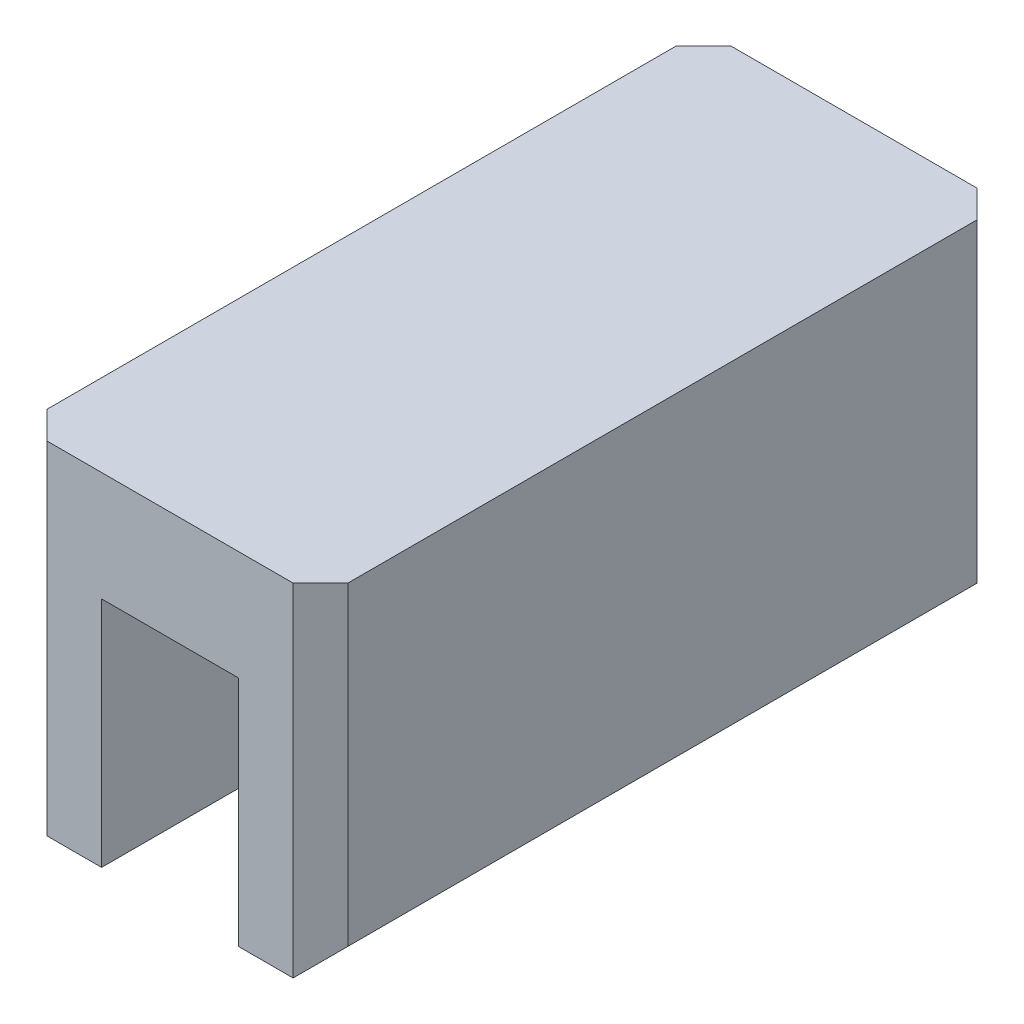
ISO-10303-21;
HEADER;
FILE_DESCRIPTION(('STEP AP214'),'2;1');
FILE_NAME('part.step','',(''),(''),'','','');
FILE_SCHEMA(('AUTOMOTIVE_DESIGN { 1 0 10303 214 1 1 1 1 }'));
ENDSEC;
DATA;
#1=APPLICATION_CONTEXT('core data for automotive mechanical design processes');
#2=APPLICATION_PROTOCOL_DEFINITION('international standard','automotive_design',2000,#1);
#3=PRODUCT_CONTEXT('',#1,'mechanical');
#4=PRODUCT('Part','Part','',(#3));
#5=PRODUCT_RELATED_PRODUCT_CATEGORY('part','',(#4));
#6=PRODUCT_DEFINITION_FORMATION('','',#4);
#7=PRODUCT_DEFINITION_CONTEXT('part definition',#1,'design');
#8=PRODUCT_DEFINITION('design','',#6,#7);
#9=PRODUCT_DEFINITION_SHAPE('','',#8);
#10=(LENGTH_UNIT() NAMED_UNIT(*) SI_UNIT(.MILLI.,.METRE.));
#11=(NAMED_UNIT(*) PLANE_ANGLE_UNIT() SI_UNIT($,.RADIAN.));
#12=(NAMED_UNIT(*) SI_UNIT($,.STERADIAN.) SOLID_ANGLE_UNIT());
#13=UNCERTAINTY_MEASURE_WITH_UNIT(LENGTH_MEASURE(1.E-05),#10,'distance_accuracy_value','');
#14=(GEOMETRIC_REPRESENTATION_CONTEXT(3) GLOBAL_UNCERTAINTY_ASSIGNED_CONTEXT((#13)) GLOBAL_UNIT_ASSIGNED_CONTEXT((#10,
#11,#12)) REPRESENTATION_CONTEXT('',''));
#15=CARTESIAN_POINT('',(0.,0.,0.));
#16=DIRECTION('',(0.,0.,1.));
#17=DIRECTION('',(1.,0.,0.));
#18=AXIS2_PLACEMENT_3D('',#15,#16,#17);
#19=CARTESIAN_POINT('',(5.,-17.,50.));
#20=DIRECTION('',(1.,0.,0.));
#21=DIRECTION('',(0.,1.,0.));
#22=AXIS2_PLACEMENT_3D('',#19,#20,#21);
#23=PLANE('',#22);
#24=DIRECTION('',(0.,-1.,0.));
#25=VECTOR('',#24,1.);
#26=CARTESIAN_POINT('',(5.,-17.,0.));
#27=LINE('',#26,#25);
#28=CARTESIAN_POINT('',(5.,0.,0.));
#29=VERTEX_POINT('',#28);
#30=CARTESIAN_POINT('',(5.,-17.,0.));
#31=VERTEX_POINT('',#30);
#32=EDGE_CURVE('E155',#29,#31,#27,.T.);
#33=ORIENTED_EDGE('',*,*,#32,.T.);
#34=DIRECTION('',(0.,0.,-1.));
#35=VECTOR('',#34,1.);
#36=CARTESIAN_POINT('',(5.,-17.,50.));
#37=LINE('',#36,#35);
#38=CARTESIAN_POINT('',(5.,-17.,50.));
#39=VERTEX_POINT('',#38);
#40=EDGE_CURVE('E136',#39,#31,#37,.T.);
#41=ORIENTED_EDGE('',*,*,#40,.F.);
#42=DIRECTION('',(0.,-1.,0.));
#43=VECTOR('',#42,1.);
#44=CARTESIAN_POINT('',(5.,-17.,50.));
#45=LINE('',#44,#43);
#46=CARTESIAN_POINT('',(5.,0.,50.));
#47=VERTEX_POINT('',#46);
#48=EDGE_CURVE('E142',#47,#39,#45,.T.);
#49=ORIENTED_EDGE('',*,*,#48,.F.);
#50=DIRECTION('',(0.,0.,-1.));
#51=VECTOR('',#50,1.);
#52=CARTESIAN_POINT('',(5.,0.,50.));
#53=LINE('',#52,#51);
#54=EDGE_CURVE('E219',#47,#29,#53,.T.);
#55=ORIENTED_EDGE('',*,*,#54,.T.);
#56=EDGE_LOOP('',(#33,#41,#49,#55));
#57=FACE_BOUND('',#56,.T.);
#58=ADVANCED_FACE('F39',(#57),#23,.F.);
#59=CARTESIAN_POINT('',(11.,-17.,50.));
#60=DIRECTION('',(0.,1.,0.));
#61=DIRECTION('',(0.,0.,1.));
#62=AXIS2_PLACEMENT_3D('',#59,#60,#61);
#63=PLANE('',#62);
#64=DIRECTION('',(1.,0.,0.));
#65=VECTOR('',#64,1.);
#66=CARTESIAN_POINT('',(11.,-17.,0.));
#67=LINE('',#66,#65);
#68=CARTESIAN_POINT('',(9.,-17.,0.));
#69=VERTEX_POINT('',#68);
#70=EDGE_CURVE('E221',#31,#69,#67,.T.);
#71=ORIENTED_EDGE('',*,*,#70,.T.);
#72=DIRECTION('',(0.,0.,1.));
#73=VECTOR('',#72,1.);
#74=CARTESIAN_POINT('',(9.,-17.,50.));
#75=LINE('',#74,#73);
#76=CARTESIAN_POINT('',(9.,-17.,50.));
#77=VERTEX_POINT('',#76);
#78=EDGE_CURVE('E11',#69,#77,#75,.T.);
#79=ORIENTED_EDGE('',*,*,#78,.T.);
#80=DIRECTION('',(1.,0.,0.));
#81=VECTOR('',#80,1.);
#82=CARTESIAN_POINT('',(11.,-17.,50.));
#83=LINE('',#82,#81);
#84=EDGE_CURVE('E131',#39,#77,#83,.T.);
#85=ORIENTED_EDGE('',*,*,#84,.F.);
#86=ORIENTED_EDGE('',*,*,#40,.T.);
#87=EDGE_LOOP('',(#71,#79,#85,#86));
#88=FACE_BOUND('',#87,.T.);
#89=ADVANCED_FACE('F134',(#88),#63,.F.);
#90=CARTESIAN_POINT('',(11.,8.,50.));
#91=DIRECTION('',(-1.,0.,0.));
#92=DIRECTION('',(0.,-1.,0.));
#93=AXIS2_PLACEMENT_3D('',#90,#91,#92);
#94=PLANE('',#93);
#95=DIRECTION('',(0.,0.,-1.));
#96=VECTOR('',#95,1.);
#97=CARTESIAN_POINT('',(11.,-15.,50.));
#98=LINE('',#97,#96);
#99=CARTESIAN_POINT('',(11.,-15.,48.));
#100=VERTEX_POINT('',#99);
#101=CARTESIAN_POINT('',(11.,-15.,2.00000000000001));
#102=VERTEX_POINT('',#101);
#103=EDGE_CURVE('E57',#100,#102,#98,.T.);
#104=ORIENTED_EDGE('',*,*,#103,.T.);
#105=DIRECTION('',(0.,1.,0.));
#106=VECTOR('',#105,1.);
#107=CARTESIAN_POINT('',(11.,8.,2.00000000000001));
#108=LINE('',#107,#106);
#109=CARTESIAN_POINT('',(11.,8.,2.00000000000001));
#110=VERTEX_POINT('',#109);
#111=EDGE_CURVE('E49',#102,#110,#108,.T.);
#112=ORIENTED_EDGE('',*,*,#111,.T.);
#113=DIRECTION('',(0.,0.,-1.));
#114=VECTOR('',#113,1.);
#115=CARTESIAN_POINT('',(11.,8.,50.));
#116=LINE('',#115,#114);
#117=CARTESIAN_POINT('',(11.,8.,48.));
#118=VERTEX_POINT('',#117);
#119=EDGE_CURVE('E157',#118,#110,#116,.T.);
#120=ORIENTED_EDGE('',*,*,#119,.F.);
#121=DIRECTION('',(0.,-1.,0.));
#122=VECTOR('',#121,1.);
#123=CARTESIAN_POINT('',(11.,-17.,48.));
#124=LINE('',#123,#122);
#125=EDGE_CURVE('E62',#118,#100,#124,.T.);
#126=ORIENTED_EDGE('',*,*,#125,.T.);
#127=EDGE_LOOP('',(#104,#112,#120,#126));
#128=FACE_BOUND('',#127,.T.);
#129=ADVANCED_FACE('F270',(#128),#94,.F.);
#130=CARTESIAN_POINT('',(-11.,8.,50.));
#131=DIRECTION('',(0.,-1.,0.));
#132=DIRECTION('',(0.,0.,-1.));
#133=AXIS2_PLACEMENT_3D('',#130,#131,#132);
#134=PLANE('',#133);
#135=DIRECTION('',(-1.,0.,0.));
#136=VECTOR('',#135,1.);
#137=CARTESIAN_POINT('',(-11.,8.,0.));
#138=LINE('',#137,#136);
#139=CARTESIAN_POINT('',(8.99999999999999,8.,0.));
#140=VERTEX_POINT('',#139);
#141=CARTESIAN_POINT('',(-8.99999999999999,8.,0.));
#142=VERTEX_POINT('',#141);
#143=EDGE_CURVE('E223',#140,#142,#138,.T.);
#144=ORIENTED_EDGE('',*,*,#143,.T.);
#145=DIRECTION('',(0.707106781186546,0.,-0.707106781186549));
#146=VECTOR('',#145,1.);
#147=CARTESIAN_POINT('',(-11.,8.,2.00000000000001));
#148=LINE('',#147,#146);
#149=CARTESIAN_POINT('',(-11.,8.,2.00000000000001));
#150=VERTEX_POINT('',#149);
#151=EDGE_CURVE('E180',#142,#150,#148,.F.);
#152=ORIENTED_EDGE('',*,*,#151,.T.);
#153=DIRECTION('',(0.,0.,-1.));
#154=VECTOR('',#153,1.);
#155=CARTESIAN_POINT('',(-11.,8.,50.));
#156=LINE('',#155,#154);
#157=CARTESIAN_POINT('',(-11.,8.,48.));
#158=VERTEX_POINT('',#157);
#159=EDGE_CURVE('E162',#158,#150,#156,.T.);
#160=ORIENTED_EDGE('',*,*,#159,.F.);
#161=DIRECTION('',(0.707106781186546,0.,0.707106781186549));
#162=VECTOR('',#161,1.);
#163=CARTESIAN_POINT('',(-8.99999999999999,8.,50.));
#164=LINE('',#163,#162);
#165=CARTESIAN_POINT('',(-8.99999999999999,8.,50.));
#166=VERTEX_POINT('',#165);
#167=EDGE_CURVE('E178',#158,#166,#164,.T.);
#168=ORIENTED_EDGE('',*,*,#167,.T.);
#169=DIRECTION('',(-1.,0.,0.));
#170=VECTOR('',#169,1.);
#171=CARTESIAN_POINT('',(-11.,8.,50.));
#172=LINE('',#171,#170);
#173=CARTESIAN_POINT('',(8.99999999999999,8.,50.));
#174=VERTEX_POINT('',#173);
#175=EDGE_CURVE('E141',#174,#166,#172,.T.);
#176=ORIENTED_EDGE('',*,*,#175,.F.);
#177=DIRECTION('',(0.707106781186546,0.,-0.707106781186549));
#178=VECTOR('',#177,1.);
#179=CARTESIAN_POINT('',(8.99999999999999,8.,50.));
#180=LINE('',#179,#178);
#181=EDGE_CURVE('E174',#174,#118,#180,.T.);
#182=ORIENTED_EDGE('',*,*,#181,.T.);
#183=ORIENTED_EDGE('',*,*,#119,.T.);
#184=DIRECTION('',(0.707106781186546,0.,0.707106781186549));
#185=VECTOR('',#184,1.);
#186=CARTESIAN_POINT('',(11.,8.,2.00000000000001));
#187=LINE('',#186,#185);
#188=EDGE_CURVE('E176',#110,#140,#187,.F.);
#189=ORIENTED_EDGE('',*,*,#188,.T.);
#190=EDGE_LOOP('',(#144,#152,#160,#168,#176,#182,#183,#189));
#191=FACE_BOUND('',#190,.T.);
#192=ADVANCED_FACE('F209',(#191),#134,.F.);
#193=CARTESIAN_POINT('',(-11.,-17.,50.));
#194=DIRECTION('',(1.,0.,0.));
#195=DIRECTION('',(0.,1.,0.));
#196=AXIS2_PLACEMENT_3D('',#193,#194,#195);
#197=PLANE('',#196);
#198=ORIENTED_EDGE('',*,*,#159,.T.);
#199=DIRECTION('',(0.,-1.,0.));
#200=VECTOR('',#199,1.);
#201=CARTESIAN_POINT('',(-11.,-17.,2.00000000000001));
#202=LINE('',#201,#200);
#203=CARTESIAN_POINT('',(-11.,-15.,2.00000000000001));
#204=VERTEX_POINT('',#203);
#205=EDGE_CURVE('E167',#150,#204,#202,.T.);
#206=ORIENTED_EDGE('',*,*,#205,.T.);
#207=DIRECTION('',(0.,0.,1.));
#208=VECTOR('',#207,1.);
#209=CARTESIAN_POINT('',(-11.,-15.,50.));
#210=LINE('',#209,#208);
#211=CARTESIAN_POINT('',(-11.,-15.,48.));
#212=VERTEX_POINT('',#211);
#213=EDGE_CURVE('E159',#204,#212,#210,.T.);
#214=ORIENTED_EDGE('',*,*,#213,.T.);
#215=DIRECTION('',(0.,1.,0.));
#216=VECTOR('',#215,1.);
#217=CARTESIAN_POINT('',(-11.,8.,48.));
#218=LINE('',#217,#216);
#219=EDGE_CURVE('E156',#212,#158,#218,.T.);
#220=ORIENTED_EDGE('',*,*,#219,.T.);
#221=EDGE_LOOP('',(#198,#206,#214,#220));
#222=FACE_BOUND('',#221,.T.);
#223=ADVANCED_FACE('F239',(#222),#197,.F.);
#224=CARTESIAN_POINT('',(-5.,-17.,50.));
#225=DIRECTION('',(0.,1.,0.));
#226=DIRECTION('',(0.,0.,1.));
#227=AXIS2_PLACEMENT_3D('',#224,#225,#226);
#228=PLANE('',#227);
#229=DIRECTION('',(1.,0.,0.));
#230=VECTOR('',#229,1.);
#231=CARTESIAN_POINT('',(-5.,-17.,50.));
#232=LINE('',#231,#230);
#233=CARTESIAN_POINT('',(-9.,-17.,50.));
#234=VERTEX_POINT('',#233);
#235=CARTESIAN_POINT('',(-5.,-17.,50.));
#236=VERTEX_POINT('',#235);
#237=EDGE_CURVE('E212',#234,#236,#232,.T.);
#238=ORIENTED_EDGE('',*,*,#237,.F.);
#239=DIRECTION('',(0.,0.,-1.));
#240=VECTOR('',#239,1.);
#241=CARTESIAN_POINT('',(-9.,-17.,50.));
#242=LINE('',#241,#240);
#243=CARTESIAN_POINT('',(-9.,-17.,0.));
#244=VERTEX_POINT('',#243);
#245=EDGE_CURVE('E182',#234,#244,#242,.T.);
#246=ORIENTED_EDGE('',*,*,#245,.T.);
#247=DIRECTION('',(1.,0.,0.));
#248=VECTOR('',#247,1.);
#249=CARTESIAN_POINT('',(-5.,-17.,0.));
#250=LINE('',#249,#248);
#251=CARTESIAN_POINT('',(-5.,-17.,0.));
#252=VERTEX_POINT('',#251);
#253=EDGE_CURVE('E225',#244,#252,#250,.T.);
#254=ORIENTED_EDGE('',*,*,#253,.T.);
#255=DIRECTION('',(0.,0.,-1.));
#256=VECTOR('',#255,1.);
#257=CARTESIAN_POINT('',(-5.,-17.,50.));
#258=LINE('',#257,#256);
#259=EDGE_CURVE('E234',#236,#252,#258,.T.);
#260=ORIENTED_EDGE('',*,*,#259,.F.);
#261=EDGE_LOOP('',(#238,#246,#254,#260));
#262=FACE_BOUND('',#261,.T.);
#263=ADVANCED_FACE('F256',(#262),#228,.F.);
#264=CARTESIAN_POINT('',(-5.,0.,50.));
#265=DIRECTION('',(-1.,0.,0.));
#266=DIRECTION('',(0.,-1.,0.));
#267=AXIS2_PLACEMENT_3D('',#264,#265,#266);
#268=PLANE('',#267);
#269=DIRECTION('',(0.,1.,0.));
#270=VECTOR('',#269,1.);
#271=CARTESIAN_POINT('',(-5.,0.,0.));
#272=LINE('',#271,#270);
#273=CARTESIAN_POINT('',(-5.,0.,0.));
#274=VERTEX_POINT('',#273);
#275=EDGE_CURVE('E227',#252,#274,#272,.T.);
#276=ORIENTED_EDGE('',*,*,#275,.T.);
#277=DIRECTION('',(0.,0.,-1.));
#278=VECTOR('',#277,1.);
#279=CARTESIAN_POINT('',(-5.,0.,50.));
#280=LINE('',#279,#278);
#281=CARTESIAN_POINT('',(-5.,0.,50.));
#282=VERTEX_POINT('',#281);
#283=EDGE_CURVE('E231',#282,#274,#280,.T.);
#284=ORIENTED_EDGE('',*,*,#283,.F.);
#285=DIRECTION('',(0.,1.,0.));
#286=VECTOR('',#285,1.);
#287=CARTESIAN_POINT('',(-5.,0.,50.));
#288=LINE('',#287,#286);
#289=EDGE_CURVE('E214',#236,#282,#288,.T.);
#290=ORIENTED_EDGE('',*,*,#289,.F.);
#291=ORIENTED_EDGE('',*,*,#259,.T.);
#292=EDGE_LOOP('',(#276,#284,#290,#291));
#293=FACE_BOUND('',#292,.T.);
#294=ADVANCED_FACE('F262',(#293),#268,.F.);
#295=CARTESIAN_POINT('',(5.,0.,50.));
#296=DIRECTION('',(0.,1.,0.));
#297=DIRECTION('',(-1.,0.,0.));
#298=AXIS2_PLACEMENT_3D('',#295,#296,#297);
#299=PLANE('',#298);
#300=DIRECTION('',(1.,0.,0.));
#301=VECTOR('',#300,1.);
#302=CARTESIAN_POINT('',(5.,0.,0.));
#303=LINE('',#302,#301);
#304=EDGE_CURVE('E152',#274,#29,#303,.T.);
#305=ORIENTED_EDGE('',*,*,#304,.T.);
#306=ORIENTED_EDGE('',*,*,#54,.F.);
#307=DIRECTION('',(1.,0.,0.));
#308=VECTOR('',#307,1.);
#309=CARTESIAN_POINT('',(5.,0.,50.));
#310=LINE('',#309,#308);
#311=EDGE_CURVE('E148',#282,#47,#310,.T.);
#312=ORIENTED_EDGE('',*,*,#311,.F.);
#313=ORIENTED_EDGE('',*,*,#283,.T.);
#314=EDGE_LOOP('',(#305,#306,#312,#313));
#315=FACE_BOUND('',#314,.T.);
#316=ADVANCED_FACE('F265',(#315),#299,.F.);
#317=CARTESIAN_POINT('',(0.,0.,50.));
#318=DIRECTION('',(0.,0.,1.));
#319=DIRECTION('',(1.,0.,0.));
#320=AXIS2_PLACEMENT_3D('',#317,#318,#319);
#321=PLANE('',#320);
#322=ORIENTED_EDGE('',*,*,#175,.T.);
#323=DIRECTION('',(0.,-1.,0.));
#324=VECTOR('',#323,1.);
#325=CARTESIAN_POINT('',(-9.,-17.,50.));
#326=LINE('',#325,#324);
#327=EDGE_CURVE('E186',#166,#234,#326,.T.);
#328=ORIENTED_EDGE('',*,*,#327,.T.);
#329=ORIENTED_EDGE('',*,*,#237,.T.);
#330=ORIENTED_EDGE('',*,*,#289,.T.);
#331=ORIENTED_EDGE('',*,*,#311,.T.);
#332=ORIENTED_EDGE('',*,*,#48,.T.);
#333=ORIENTED_EDGE('',*,*,#84,.T.);
#334=DIRECTION('',(0.,1.,0.));
#335=VECTOR('',#334,1.);
#336=CARTESIAN_POINT('',(8.99999999999999,8.,50.));
#337=LINE('',#336,#335);
#338=EDGE_CURVE('E184',#77,#174,#337,.T.);
#339=ORIENTED_EDGE('',*,*,#338,.T.);
#340=EDGE_LOOP('',(#322,#328,#329,#330,#331,#332,#333,#339));
#341=FACE_BOUND('',#340,.T.);
#342=ADVANCED_FACE('F146',(#341),#321,.T.);
#343=CARTESIAN_POINT('',(0.,0.,0.));
#344=DIRECTION('',(0.,0.,1.));
#345=DIRECTION('',(1.,0.,0.));
#346=AXIS2_PLACEMENT_3D('',#343,#344,#345);
#347=PLANE('',#346);
#348=ORIENTED_EDGE('',*,*,#253,.F.);
#349=DIRECTION('',(0.,1.,0.));
#350=VECTOR('',#349,1.);
#351=CARTESIAN_POINT('',(-8.99999999999999,0.,0.));
#352=LINE('',#351,#350);
#353=EDGE_CURVE('E172',#244,#142,#352,.T.);
#354=ORIENTED_EDGE('',*,*,#353,.T.);
#355=ORIENTED_EDGE('',*,*,#143,.F.);
#356=DIRECTION('',(0.,-1.,0.));
#357=VECTOR('',#356,1.);
#358=CARTESIAN_POINT('',(8.99999999999999,0.,0.));
#359=LINE('',#358,#357);
#360=EDGE_CURVE('E170',#140,#69,#359,.T.);
#361=ORIENTED_EDGE('',*,*,#360,.T.);
#362=ORIENTED_EDGE('',*,*,#70,.F.);
#363=ORIENTED_EDGE('',*,*,#32,.F.);
#364=ORIENTED_EDGE('',*,*,#304,.F.);
#365=ORIENTED_EDGE('',*,*,#275,.F.);
#366=EDGE_LOOP('',(#348,#354,#355,#361,#362,#363,#364,#365));
#367=FACE_BOUND('',#366,.T.);
#368=ADVANCED_FACE('F267',(#367),#347,.F.);
#369=CARTESIAN_POINT('',(-8.99999999999999,0.,50.));
#370=DIRECTION('',(-0.707106781186549,0.,0.707106781186546));
#371=DIRECTION('',(0.,1.,0.));
#372=AXIS2_PLACEMENT_3D('',#369,#370,#371);
#373=PLANE('',#372);
#374=ORIENTED_EDGE('',*,*,#167,.F.);
#375=ORIENTED_EDGE('',*,*,#219,.F.);
#376=DIRECTION('',(-0.577350269189624,0.577350269189626,-0.577350269189627));
#377=VECTOR('',#376,1.);
#378=CARTESIAN_POINT('',(-14.6666666666667,-11.3333333333333,44.3333333333333));
#379=LINE('',#378,#377);
#380=EDGE_CURVE('E193',#234,#212,#379,.T.);
#381=ORIENTED_EDGE('',*,*,#380,.F.);
#382=ORIENTED_EDGE('',*,*,#327,.F.);
#383=EDGE_LOOP('',(#374,#375,#381,#382));
#384=FACE_BOUND('',#383,.T.);
#385=ADVANCED_FACE('F252',(#384),#373,.T.);
#386=CARTESIAN_POINT('',(-9.,-17.,50.));
#387=DIRECTION('',(0.707106781186549,0.707106781186546,0.));
#388=DIRECTION('',(0.,0.,-1.));
#389=AXIS2_PLACEMENT_3D('',#386,#387,#388);
#390=PLANE('',#389);
#391=ORIENTED_EDGE('',*,*,#380,.T.);
#392=ORIENTED_EDGE('',*,*,#213,.F.);
#393=DIRECTION('',(0.577350269189624,-0.577350269189626,-0.577350269189627));
#394=VECTOR('',#393,1.);
#395=CARTESIAN_POINT('',(-25.6666666666666,-0.333333333333293,16.6666666666667));
#396=LINE('',#395,#394);
#397=EDGE_CURVE('E191',#244,#204,#396,.F.);
#398=ORIENTED_EDGE('',*,*,#397,.F.);
#399=ORIENTED_EDGE('',*,*,#245,.F.);
#400=EDGE_LOOP('',(#391,#392,#398,#399));
#401=FACE_BOUND('',#400,.T.);
#402=ADVANCED_FACE('F249',(#401),#390,.F.);
#403=CARTESIAN_POINT('',(-11.,-17.,2.00000000000001));
#404=DIRECTION('',(0.707106781186549,0.,0.707106781186546));
#405=DIRECTION('',(0.,-1.,0.));
#406=AXIS2_PLACEMENT_3D('',#403,#404,#405);
#407=PLANE('',#406);
#408=ORIENTED_EDGE('',*,*,#151,.F.);
#409=ORIENTED_EDGE('',*,*,#353,.F.);
#410=ORIENTED_EDGE('',*,*,#397,.T.);
#411=ORIENTED_EDGE('',*,*,#205,.F.);
#412=EDGE_LOOP('',(#408,#409,#410,#411));
#413=FACE_BOUND('',#412,.T.);
#414=ADVANCED_FACE('F243',(#413),#407,.F.);
#415=CARTESIAN_POINT('',(8.99999999999999,0.,50.));
#416=DIRECTION('',(0.707106781186549,0.,0.707106781186546));
#417=DIRECTION('',(0.,-1.,0.));
#418=AXIS2_PLACEMENT_3D('',#415,#416,#417);
#419=PLANE('',#418);
#420=ORIENTED_EDGE('',*,*,#181,.F.);
#421=ORIENTED_EDGE('',*,*,#338,.F.);
#422=DIRECTION('',(-0.577350269189624,-0.577350269189627,0.577350269189626));
#423=VECTOR('',#422,1.);
#424=CARTESIAN_POINT('',(14.6666666666667,-11.3333333333333,44.3333333333333));
#425=LINE('',#424,#423);
#426=EDGE_CURVE('E44',#100,#77,#425,.T.);
#427=ORIENTED_EDGE('',*,*,#426,.F.);
#428=ORIENTED_EDGE('',*,*,#125,.F.);
#429=EDGE_LOOP('',(#420,#421,#427,#428));
#430=FACE_BOUND('',#429,.T.);
#431=ADVANCED_FACE('F42',(#430),#419,.T.);
#432=CARTESIAN_POINT('',(11.,-15.,50.));
#433=DIRECTION('',(-0.707106781186549,0.707106781186546,0.));
#434=DIRECTION('',(0.,0.,-1.));
#435=AXIS2_PLACEMENT_3D('',#432,#433,#434);
#436=PLANE('',#435);
#437=ORIENTED_EDGE('',*,*,#426,.T.);
#438=ORIENTED_EDGE('',*,*,#78,.F.);
#439=DIRECTION('',(0.577350269189624,0.577350269189627,0.577350269189626));
#440=VECTOR('',#439,1.);
#441=CARTESIAN_POINT('',(27.,1.00000000000005,18.));
#442=LINE('',#441,#440);
#443=EDGE_CURVE('E195',#102,#69,#442,.F.);
#444=ORIENTED_EDGE('',*,*,#443,.F.);
#445=ORIENTED_EDGE('',*,*,#103,.F.);
#446=EDGE_LOOP('',(#437,#438,#444,#445));
#447=FACE_BOUND('',#446,.T.);
#448=ADVANCED_FACE('F202',(#447),#436,.F.);
#449=CARTESIAN_POINT('',(11.,8.,2.00000000000001));
#450=DIRECTION('',(-0.707106781186549,0.,0.707106781186546));
#451=DIRECTION('',(0.,1.,0.));
#452=AXIS2_PLACEMENT_3D('',#449,#450,#451);
#453=PLANE('',#452);
#454=ORIENTED_EDGE('',*,*,#443,.T.);
#455=ORIENTED_EDGE('',*,*,#360,.F.);
#456=ORIENTED_EDGE('',*,*,#188,.F.);
#457=ORIENTED_EDGE('',*,*,#111,.F.);
#458=EDGE_LOOP('',(#454,#455,#456,#457));
#459=FACE_BOUND('',#458,.T.);
#460=ADVANCED_FACE('F269',(#459),#453,.F.);
#461=CLOSED_SHELL('',(#58,#89,#129,#192,#223,#263,#294,#316,#342,#368,#385,#402,#414,#431,#448,#460));
#462=MANIFOLD_SOLID_BREP('B2',#461);
#463=ADVANCED_BREP_SHAPE_REPRESENTATION('',(#18,#462),#14);
#464=SHAPE_DEFINITION_REPRESENTATION(#9,#463);
ENDSEC;
END-ISO-10303-21;
